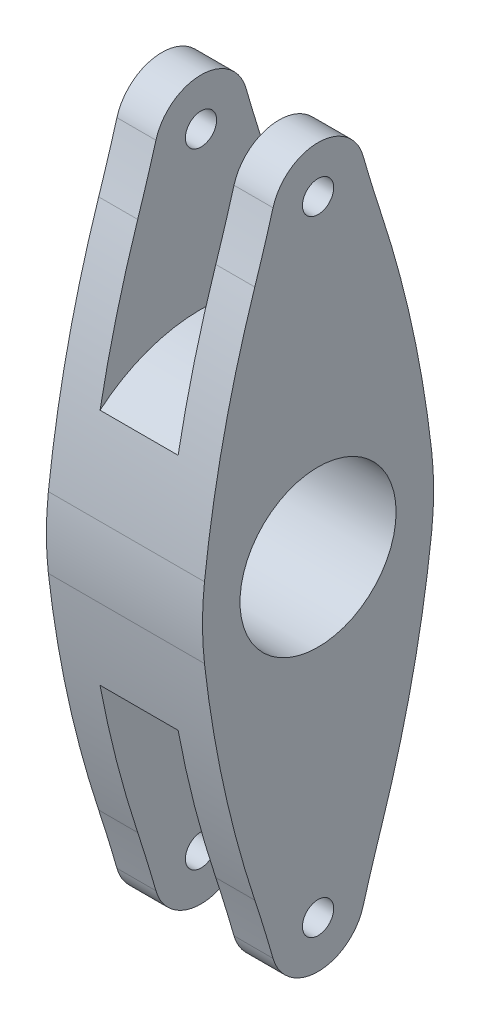
ISO-10303-21;
HEADER;
FILE_DESCRIPTION(('STEP AP214'),'2;1');
FILE_NAME('part.step','',(''),(''),'','','');
FILE_SCHEMA(('AUTOMOTIVE_DESIGN { 1 0 10303 214 1 1 1 1 }'));
ENDSEC;
DATA;
#1=APPLICATION_CONTEXT('core data for automotive mechanical design processes');
#2=APPLICATION_PROTOCOL_DEFINITION('international standard','automotive_design',2000,#1);
#3=PRODUCT_CONTEXT('',#1,'mechanical');
#4=PRODUCT('Part','Part','',(#3));
#5=PRODUCT_RELATED_PRODUCT_CATEGORY('part','',(#4));
#6=PRODUCT_DEFINITION_FORMATION('','',#4);
#7=PRODUCT_DEFINITION_CONTEXT('part definition',#1,'design');
#8=PRODUCT_DEFINITION('design','',#6,#7);
#9=PRODUCT_DEFINITION_SHAPE('','',#8);
#10=(LENGTH_UNIT() NAMED_UNIT(*) SI_UNIT(.MILLI.,.METRE.));
#11=(NAMED_UNIT(*) PLANE_ANGLE_UNIT() SI_UNIT($,.RADIAN.));
#12=(NAMED_UNIT(*) SI_UNIT($,.STERADIAN.) SOLID_ANGLE_UNIT());
#13=UNCERTAINTY_MEASURE_WITH_UNIT(LENGTH_MEASURE(1.E-05),#10,'distance_accuracy_value','');
#14=(GEOMETRIC_REPRESENTATION_CONTEXT(3) GLOBAL_UNCERTAINTY_ASSIGNED_CONTEXT((#13)) GLOBAL_UNIT_ASSIGNED_CONTEXT((#10,
#11,#12)) REPRESENTATION_CONTEXT('',''));
#15=CARTESIAN_POINT('',(0.,0.,0.));
#16=DIRECTION('',(0.,0.,1.));
#17=DIRECTION('',(1.,0.,0.));
#18=AXIS2_PLACEMENT_3D('',#15,#16,#17);
#19=CARTESIAN_POINT('',(5.,-3.08420119348635,-33.3047830821615));
#20=DIRECTION('',(-1.,0.,0.));
#21=DIRECTION('',(0.,0.,1.));
#22=AXIS2_PLACEMENT_3D('',#19,#20,#21);
#23=CYLINDRICAL_SURFACE('',#22,37.1829160538539);
#24=CARTESIAN_POINT('',(3.75,-3.08420119348635,-33.3047830821615));
#25=DIRECTION('',(-1.,0.,0.));
#26=DIRECTION('',(0.,0.,1.));
#27=AXIS2_PLACEMENT_3D('',#24,#25,#26);
#28=CIRCLE('',#27,37.1829160538539);
#29=CARTESIAN_POINT('',(3.75,3.8145264666766,3.23255128884657));
#30=VERTEX_POINT('',#29);
#31=CARTESIAN_POINT('',(3.75,8.50449351808189,2.02610144044867));
#32=VERTEX_POINT('',#31);
#33=EDGE_CURVE('E277',#30,#32,#28,.T.);
#34=ORIENTED_EDGE('',*,*,#33,.F.);
#35=DIRECTION('',(-1.,0.,0.));
#36=VECTOR('',#35,1.);
#37=CARTESIAN_POINT('',(3.75,3.8145264666766,3.23255128884657));
#38=LINE('',#37,#36);
#39=CARTESIAN_POINT('',(1.25,3.8145264666766,3.23255128884657));
#40=VERTEX_POINT('',#39);
#41=EDGE_CURVE('E243',#30,#40,#38,.T.);
#42=ORIENTED_EDGE('',*,*,#41,.T.);
#43=CARTESIAN_POINT('',(1.25,-3.08420119348635,-33.3047830821615));
#44=DIRECTION('',(-1.,0.,0.));
#45=DIRECTION('',(0.,0.,1.));
#46=AXIS2_PLACEMENT_3D('',#43,#44,#45);
#47=CIRCLE('',#46,37.1829160538539);
#48=CARTESIAN_POINT('',(1.25,8.50449351808189,2.02610144044867));
#49=VERTEX_POINT('',#48);
#50=EDGE_CURVE('E259',#40,#49,#47,.T.);
#51=ORIENTED_EDGE('',*,*,#50,.T.);
#52=DIRECTION('',(-1.,0.,0.));
#53=VECTOR('',#52,1.);
#54=CARTESIAN_POINT('',(5.,8.50449351808189,2.02610144044867));
#55=LINE('',#54,#53);
#56=CARTESIAN_POINT('',(0.,8.5044935180819,2.02610144044867));
#57=VERTEX_POINT('',#56);
#58=EDGE_CURVE('E391',#49,#57,#55,.T.);
#59=ORIENTED_EDGE('',*,*,#58,.T.);
#60=CARTESIAN_POINT('',(0.,-3.08420119348635,-33.3047830821615));
#61=DIRECTION('',(1.,0.,0.));
#62=DIRECTION('',(0.,0.,1.));
#63=AXIS2_PLACEMENT_3D('',#60,#61,#62);
#64=CIRCLE('',#63,37.1829160538539);
#65=CARTESIAN_POINT('',(0.,1.13461013063353,3.63802240523242));
#66=VERTEX_POINT('',#65);
#67=EDGE_CURVE('E323',#57,#66,#64,.T.);
#68=ORIENTED_EDGE('',*,*,#67,.T.);
#69=DIRECTION('',(-1.,0.,0.));
#70=VECTOR('',#69,1.);
#71=CARTESIAN_POINT('',(5.,1.13461013063353,3.63802240523242));
#72=LINE('',#71,#70);
#73=CARTESIAN_POINT('',(5.,1.13461013063353,3.63802240523242));
#74=VERTEX_POINT('',#73);
#75=EDGE_CURVE('E447',#66,#74,#72,.F.);
#76=ORIENTED_EDGE('',*,*,#75,.T.);
#77=CARTESIAN_POINT('',(5.,-3.08420119348635,-33.3047830821615));
#78=DIRECTION('',(1.,0.,0.));
#79=DIRECTION('',(0.,0.,1.));
#80=AXIS2_PLACEMENT_3D('',#77,#78,#79);
#81=CIRCLE('',#80,37.1829160538539);
#82=CARTESIAN_POINT('',(5.,8.5044935180819,2.02610144044867));
#83=VERTEX_POINT('',#82);
#84=EDGE_CURVE('E327',#83,#74,#81,.T.);
#85=ORIENTED_EDGE('',*,*,#84,.F.);
#86=EDGE_CURVE('E392',#83,#32,#55,.T.);
#87=ORIENTED_EDGE('',*,*,#86,.T.);
#88=EDGE_LOOP('',(#34,#42,#51,#59,#68,#76,#85,#87));
#89=FACE_BOUND('',#88,.T.);
#90=ADVANCED_FACE('F42',(#89),#23,.T.);
#91=CARTESIAN_POINT('',(5.,3.08420119348635,-33.3047830821615));
#92=DIRECTION('',(-1.,0.,0.));
#93=DIRECTION('',(0.,0.,1.));
#94=AXIS2_PLACEMENT_3D('',#91,#92,#93);
#95=CYLINDRICAL_SURFACE('',#94,37.1829160538539);
#96=CARTESIAN_POINT('',(3.75,3.08420119348635,-33.3047830821615));
#97=DIRECTION('',(-1.,0.,0.));
#98=DIRECTION('',(0.,0.,1.));
#99=AXIS2_PLACEMENT_3D('',#96,#97,#98);
#100=CIRCLE('',#99,37.1829160538539);
#101=CARTESIAN_POINT('',(3.75,-8.50449351808188,2.02610144044867));
#102=VERTEX_POINT('',#101);
#103=CARTESIAN_POINT('',(3.75,-3.8145264666766,3.23255128884656));
#104=VERTEX_POINT('',#103);
#105=EDGE_CURVE('E216',#102,#104,#100,.T.);
#106=ORIENTED_EDGE('',*,*,#105,.F.);
#107=DIRECTION('',(-1.,0.,0.));
#108=VECTOR('',#107,1.);
#109=CARTESIAN_POINT('',(5.,-8.50449351808186,2.02610144044869));
#110=LINE('',#109,#108);
#111=CARTESIAN_POINT('',(5.,-8.50449351808186,2.02610144044869));
#112=VERTEX_POINT('',#111);
#113=EDGE_CURVE('E387',#102,#112,#110,.F.);
#114=ORIENTED_EDGE('',*,*,#113,.T.);
#115=CARTESIAN_POINT('',(5.,3.08420119348635,-33.3047830821615));
#116=DIRECTION('',(1.,0.,0.));
#117=DIRECTION('',(0.,0.,-1.));
#118=AXIS2_PLACEMENT_3D('',#115,#116,#117);
#119=CIRCLE('',#118,37.1829160538539);
#120=CARTESIAN_POINT('',(5.,-1.13461013063353,3.63802240523242));
#121=VERTEX_POINT('',#120);
#122=EDGE_CURVE('E331',#121,#112,#119,.T.);
#123=ORIENTED_EDGE('',*,*,#122,.F.);
#124=DIRECTION('',(-1.,0.,0.));
#125=VECTOR('',#124,1.);
#126=CARTESIAN_POINT('',(5.,-1.13461013063353,3.63802240523242));
#127=LINE('',#126,#125);
#128=CARTESIAN_POINT('',(0.,-1.13461013063353,3.63802240523242));
#129=VERTEX_POINT('',#128);
#130=EDGE_CURVE('E437',#121,#129,#127,.T.);
#131=ORIENTED_EDGE('',*,*,#130,.T.);
#132=CARTESIAN_POINT('',(0.,3.08420119348635,-33.3047830821615));
#133=DIRECTION('',(1.,0.,0.));
#134=DIRECTION('',(0.,0.,-1.));
#135=AXIS2_PLACEMENT_3D('',#132,#133,#134);
#136=CIRCLE('',#135,37.1829160538539);
#137=CARTESIAN_POINT('',(0.,-8.50449351808186,2.02610144044869));
#138=VERTEX_POINT('',#137);
#139=EDGE_CURVE('E356',#129,#138,#136,.T.);
#140=ORIENTED_EDGE('',*,*,#139,.T.);
#141=CARTESIAN_POINT('',(1.25,-8.50449351808186,2.02610144044869));
#142=VERTEX_POINT('',#141);
#143=EDGE_CURVE('E388',#138,#142,#110,.F.);
#144=ORIENTED_EDGE('',*,*,#143,.T.);
#145=CARTESIAN_POINT('',(1.25,3.08420119348635,-33.3047830821615));
#146=DIRECTION('',(-1.,0.,0.));
#147=DIRECTION('',(0.,0.,1.));
#148=AXIS2_PLACEMENT_3D('',#145,#146,#147);
#149=CIRCLE('',#148,37.1829160538539);
#150=CARTESIAN_POINT('',(1.25,-3.8145264666766,3.23255128884656));
#151=VERTEX_POINT('',#150);
#152=EDGE_CURVE('E58',#142,#151,#149,.T.);
#153=ORIENTED_EDGE('',*,*,#152,.T.);
#154=DIRECTION('',(-1.,0.,0.));
#155=VECTOR('',#154,1.);
#156=CARTESIAN_POINT('',(3.75,-3.8145264666766,3.23255128884656));
#157=LINE('',#156,#155);
#158=EDGE_CURVE('E209',#104,#151,#157,.T.);
#159=ORIENTED_EDGE('',*,*,#158,.F.);
#160=EDGE_LOOP('',(#106,#114,#123,#131,#140,#144,#153,#159));
#161=FACE_BOUND('',#160,.T.);
#162=ADVANCED_FACE('F227',(#161),#95,.T.);
#163=CARTESIAN_POINT('',(5.,-10.,0.));
#164=DIRECTION('',(-1.,0.,0.));
#165=DIRECTION('',(0.,0.,1.));
#166=AXIS2_PLACEMENT_3D('',#163,#164,#165);
#167=CYLINDRICAL_SURFACE('',#166,1.5);
#168=CARTESIAN_POINT('',(3.75,-10.,0.));
#169=DIRECTION('',(-1.,0.,0.));
#170=DIRECTION('',(0.,0.,1.));
#171=AXIS2_PLACEMENT_3D('',#168,#169,#170);
#172=CIRCLE('',#171,1.5);
#173=CARTESIAN_POINT('',(3.75,-10.4103258062322,-1.44278644737878));
#174=VERTEX_POINT('',#173);
#175=CARTESIAN_POINT('',(3.75,-10.4103258062322,1.44278644737878));
#176=VERTEX_POINT('',#175);
#177=EDGE_CURVE('E235',#174,#176,#172,.T.);
#178=ORIENTED_EDGE('',*,*,#177,.F.);
#179=DIRECTION('',(-1.,0.,0.));
#180=VECTOR('',#179,1.);
#181=CARTESIAN_POINT('',(5.,-10.4103258062322,-1.44278644737879));
#182=LINE('',#181,#180);
#183=CARTESIAN_POINT('',(5.,-10.4103258062322,-1.44278644737879));
#184=VERTEX_POINT('',#183);
#185=EDGE_CURVE('E382',#174,#184,#182,.F.);
#186=ORIENTED_EDGE('',*,*,#185,.T.);
#187=CARTESIAN_POINT('',(5.,-10.,0.));
#188=DIRECTION('',(1.,0.,0.));
#189=DIRECTION('',(0.,0.,-1.));
#190=AXIS2_PLACEMENT_3D('',#187,#188,#189);
#191=CIRCLE('',#190,1.5);
#192=CARTESIAN_POINT('',(5.,-10.4103258062322,1.44278644737878));
#193=VERTEX_POINT('',#192);
#194=EDGE_CURVE('E336',#193,#184,#191,.T.);
#195=ORIENTED_EDGE('',*,*,#194,.F.);
#196=DIRECTION('',(-1.,0.,0.));
#197=VECTOR('',#196,1.);
#198=CARTESIAN_POINT('',(5.,-10.4103258062322,1.44278644737878));
#199=LINE('',#198,#197);
#200=EDGE_CURVE('E378',#193,#176,#199,.T.);
#201=ORIENTED_EDGE('',*,*,#200,.T.);
#202=EDGE_LOOP('',(#178,#186,#195,#201));
#203=FACE_BOUND('',#202,.T.);
#204=ADVANCED_FACE('F558',(#203),#167,.T.);
#205=CARTESIAN_POINT('',(5.,3.08420119348634,33.3047830821615));
#206=DIRECTION('',(-1.,0.,0.));
#207=DIRECTION('',(0.,0.,1.));
#208=AXIS2_PLACEMENT_3D('',#205,#206,#207);
#209=CYLINDRICAL_SURFACE('',#208,37.1829160538539);
#210=CARTESIAN_POINT('',(3.75,3.08420119348634,33.3047830821615));
#211=DIRECTION('',(-1.,0.,0.));
#212=DIRECTION('',(0.,0.,1.));
#213=AXIS2_PLACEMENT_3D('',#210,#211,#212);
#214=CIRCLE('',#213,37.1829160538539);
#215=CARTESIAN_POINT('',(3.75,-3.81452646667659,-3.23255128884657));
#216=VERTEX_POINT('',#215);
#217=CARTESIAN_POINT('',(3.75,-8.50449351808187,-2.02610144044868));
#218=VERTEX_POINT('',#217);
#219=EDGE_CURVE('E215',#216,#218,#214,.T.);
#220=ORIENTED_EDGE('',*,*,#219,.F.);
#221=DIRECTION('',(-1.,0.,0.));
#222=VECTOR('',#221,1.);
#223=CARTESIAN_POINT('',(3.75,-3.81452646667659,-3.23255128884657));
#224=LINE('',#223,#222);
#225=CARTESIAN_POINT('',(1.25,-3.81452646667659,-3.23255128884657));
#226=VERTEX_POINT('',#225);
#227=EDGE_CURVE('E211',#216,#226,#224,.T.);
#228=ORIENTED_EDGE('',*,*,#227,.T.);
#229=CARTESIAN_POINT('',(1.25,3.08420119348634,33.3047830821615));
#230=DIRECTION('',(-1.,0.,0.));
#231=DIRECTION('',(0.,0.,1.));
#232=AXIS2_PLACEMENT_3D('',#229,#230,#231);
#233=CIRCLE('',#232,37.1829160538539);
#234=CARTESIAN_POINT('',(1.25,-8.50449351808187,-2.02610144044868));
#235=VERTEX_POINT('',#234);
#236=EDGE_CURVE('E501',#226,#235,#233,.T.);
#237=ORIENTED_EDGE('',*,*,#236,.T.);
#238=DIRECTION('',(-1.,0.,0.));
#239=VECTOR('',#238,1.);
#240=CARTESIAN_POINT('',(5.,-8.50449351808189,-2.02610144044867));
#241=LINE('',#240,#239);
#242=CARTESIAN_POINT('',(0.,-8.50449351808189,-2.02610144044867));
#243=VERTEX_POINT('',#242);
#244=EDGE_CURVE('E352',#235,#243,#241,.T.);
#245=ORIENTED_EDGE('',*,*,#244,.T.);
#246=CARTESIAN_POINT('',(0.,3.08420119348634,33.3047830821615));
#247=DIRECTION('',(1.,0.,0.));
#248=DIRECTION('',(0.,0.,1.));
#249=AXIS2_PLACEMENT_3D('',#246,#247,#248);
#250=CIRCLE('',#249,37.1829160538539);
#251=CARTESIAN_POINT('',(0.,-1.13461013063353,-3.63802240523242));
#252=VERTEX_POINT('',#251);
#253=EDGE_CURVE('E363',#243,#252,#250,.T.);
#254=ORIENTED_EDGE('',*,*,#253,.T.);
#255=DIRECTION('',(-1.,0.,0.));
#256=VECTOR('',#255,1.);
#257=CARTESIAN_POINT('',(5.,-1.13461013063353,-3.63802240523242));
#258=LINE('',#257,#256);
#259=CARTESIAN_POINT('',(5.,-1.13461013063353,-3.63802240523242));
#260=VERTEX_POINT('',#259);
#261=EDGE_CURVE('E11',#252,#260,#258,.F.);
#262=ORIENTED_EDGE('',*,*,#261,.T.);
#263=CARTESIAN_POINT('',(5.,3.08420119348634,33.3047830821615));
#264=DIRECTION('',(1.,0.,0.));
#265=DIRECTION('',(0.,0.,1.));
#266=AXIS2_PLACEMENT_3D('',#263,#264,#265);
#267=CIRCLE('',#266,37.1829160538539);
#268=CARTESIAN_POINT('',(5.,-8.50449351808189,-2.02610144044867));
#269=VERTEX_POINT('',#268);
#270=EDGE_CURVE('E340',#269,#260,#267,.T.);
#271=ORIENTED_EDGE('',*,*,#270,.F.);
#272=EDGE_CURVE('E373',#269,#218,#241,.T.);
#273=ORIENTED_EDGE('',*,*,#272,.T.);
#274=EDGE_LOOP('',(#220,#228,#237,#245,#254,#262,#271,#273));
#275=FACE_BOUND('',#274,.T.);
#276=ADVANCED_FACE('F499',(#275),#209,.T.);
#277=CARTESIAN_POINT('',(5.,-3.08420119348634,33.3047830821615));
#278=DIRECTION('',(-1.,0.,0.));
#279=DIRECTION('',(0.,0.,1.));
#280=AXIS2_PLACEMENT_3D('',#277,#278,#279);
#281=CYLINDRICAL_SURFACE('',#280,37.1829160538539);
#282=CARTESIAN_POINT('',(3.75,-3.08420119348634,33.3047830821615));
#283=DIRECTION('',(-1.,0.,0.));
#284=DIRECTION('',(0.,0.,1.));
#285=AXIS2_PLACEMENT_3D('',#282,#283,#284);
#286=CIRCLE('',#285,37.1829160538539);
#287=CARTESIAN_POINT('',(3.75,8.50449351808186,-2.02610144044868));
#288=VERTEX_POINT('',#287);
#289=CARTESIAN_POINT('',(3.75,3.81452646667659,-3.23255128884657));
#290=VERTEX_POINT('',#289);
#291=EDGE_CURVE('E251',#288,#290,#286,.T.);
#292=ORIENTED_EDGE('',*,*,#291,.F.);
#293=DIRECTION('',(-1.,0.,0.));
#294=VECTOR('',#293,1.);
#295=CARTESIAN_POINT('',(5.,8.50449351808189,-2.02610144044867));
#296=LINE('',#295,#294);
#297=CARTESIAN_POINT('',(5.,8.50449351808189,-2.02610144044867));
#298=VERTEX_POINT('',#297);
#299=EDGE_CURVE('E406',#288,#298,#296,.F.);
#300=ORIENTED_EDGE('',*,*,#299,.T.);
#301=CARTESIAN_POINT('',(5.,-3.08420119348634,33.3047830821615));
#302=DIRECTION('',(1.,0.,0.));
#303=DIRECTION('',(0.,0.,-1.));
#304=AXIS2_PLACEMENT_3D('',#301,#302,#303);
#305=CIRCLE('',#304,37.1829160538539);
#306=CARTESIAN_POINT('',(5.,1.13461013063353,-3.63802240523242));
#307=VERTEX_POINT('',#306);
#308=EDGE_CURVE('E344',#307,#298,#305,.T.);
#309=ORIENTED_EDGE('',*,*,#308,.F.);
#310=DIRECTION('',(-1.,0.,0.));
#311=VECTOR('',#310,1.);
#312=CARTESIAN_POINT('',(5.,1.13461013063353,-3.63802240523242));
#313=LINE('',#312,#311);
#314=CARTESIAN_POINT('',(0.,1.13461013063353,-3.63802240523242));
#315=VERTEX_POINT('',#314);
#316=EDGE_CURVE('E51',#307,#315,#313,.T.);
#317=ORIENTED_EDGE('',*,*,#316,.T.);
#318=CARTESIAN_POINT('',(0.,-3.08420119348634,33.3047830821615));
#319=DIRECTION('',(1.,0.,0.));
#320=DIRECTION('',(0.,0.,-1.));
#321=AXIS2_PLACEMENT_3D('',#318,#319,#320);
#322=CIRCLE('',#321,37.1829160538539);
#323=CARTESIAN_POINT('',(0.,8.50449351808189,-2.02610144044867));
#324=VERTEX_POINT('',#323);
#325=EDGE_CURVE('E367',#315,#324,#322,.T.);
#326=ORIENTED_EDGE('',*,*,#325,.T.);
#327=CARTESIAN_POINT('',(1.25,8.50449351808189,-2.02610144044867));
#328=VERTEX_POINT('',#327);
#329=EDGE_CURVE('E407',#324,#328,#296,.F.);
#330=ORIENTED_EDGE('',*,*,#329,.T.);
#331=CARTESIAN_POINT('',(1.25,-3.08420119348634,33.3047830821615));
#332=DIRECTION('',(-1.,0.,0.));
#333=DIRECTION('',(0.,0.,1.));
#334=AXIS2_PLACEMENT_3D('',#331,#332,#333);
#335=CIRCLE('',#334,37.1829160538539);
#336=CARTESIAN_POINT('',(1.25,3.81452646667659,-3.23255128884657));
#337=VERTEX_POINT('',#336);
#338=EDGE_CURVE('E66',#328,#337,#335,.T.);
#339=ORIENTED_EDGE('',*,*,#338,.T.);
#340=DIRECTION('',(-1.,0.,0.));
#341=VECTOR('',#340,1.);
#342=CARTESIAN_POINT('',(3.75,3.81452646667659,-3.23255128884657));
#343=LINE('',#342,#341);
#344=EDGE_CURVE('E239',#290,#337,#343,.T.);
#345=ORIENTED_EDGE('',*,*,#344,.F.);
#346=EDGE_LOOP('',(#292,#300,#309,#317,#326,#330,#339,#345));
#347=FACE_BOUND('',#346,.T.);
#348=ADVANCED_FACE('F462',(#347),#281,.T.);
#349=CARTESIAN_POINT('',(5.,10.,0.));
#350=DIRECTION('',(-1.,0.,0.));
#351=DIRECTION('',(0.,0.,1.));
#352=AXIS2_PLACEMENT_3D('',#349,#350,#351);
#353=CYLINDRICAL_SURFACE('',#352,1.5);
#354=CARTESIAN_POINT('',(3.75,10.,0.));
#355=DIRECTION('',(-1.,0.,0.));
#356=DIRECTION('',(0.,0.,1.));
#357=AXIS2_PLACEMENT_3D('',#354,#355,#356);
#358=CIRCLE('',#357,1.5);
#359=CARTESIAN_POINT('',(3.75,10.4103258062322,1.44278644737877));
#360=VERTEX_POINT('',#359);
#361=CARTESIAN_POINT('',(3.75,10.4103258062322,-1.44278644737879));
#362=VERTEX_POINT('',#361);
#363=EDGE_CURVE('E271',#360,#362,#358,.T.);
#364=ORIENTED_EDGE('',*,*,#363,.F.);
#365=DIRECTION('',(-1.,0.,0.));
#366=VECTOR('',#365,1.);
#367=CARTESIAN_POINT('',(5.,10.4103258062322,1.44278644737878));
#368=LINE('',#367,#366);
#369=CARTESIAN_POINT('',(5.,10.4103258062322,1.44278644737878));
#370=VERTEX_POINT('',#369);
#371=EDGE_CURVE('E401',#360,#370,#368,.F.);
#372=ORIENTED_EDGE('',*,*,#371,.T.);
#373=CARTESIAN_POINT('',(5.,10.,0.));
#374=DIRECTION('',(1.,0.,0.));
#375=DIRECTION('',(0.,0.,-1.));
#376=AXIS2_PLACEMENT_3D('',#373,#374,#375);
#377=CIRCLE('',#376,1.5);
#378=CARTESIAN_POINT('',(5.,10.4103258062322,-1.44278644737878));
#379=VERTEX_POINT('',#378);
#380=EDGE_CURVE('E348',#379,#370,#377,.T.);
#381=ORIENTED_EDGE('',*,*,#380,.F.);
#382=DIRECTION('',(-1.,0.,0.));
#383=VECTOR('',#382,1.);
#384=CARTESIAN_POINT('',(5.,10.4103258062322,-1.44278644737878));
#385=LINE('',#384,#383);
#386=EDGE_CURVE('E397',#379,#362,#385,.T.);
#387=ORIENTED_EDGE('',*,*,#386,.T.);
#388=EDGE_LOOP('',(#364,#372,#381,#387));
#389=FACE_BOUND('',#388,.T.);
#390=ADVANCED_FACE('F542',(#389),#353,.T.);
#391=CARTESIAN_POINT('',(5.,10.,0.));
#392=DIRECTION('',(-1.,0.,0.));
#393=DIRECTION('',(0.,0.,1.));
#394=AXIS2_PLACEMENT_3D('',#391,#392,#393);
#395=CYLINDRICAL_SURFACE('',#394,0.5);
#396=CARTESIAN_POINT('',(5.,10.,0.));
#397=DIRECTION('',(1.,0.,0.));
#398=DIRECTION('',(0.,0.,-1.));
#399=AXIS2_PLACEMENT_3D('',#396,#397,#398);
#400=CIRCLE('',#399,0.5);
#401=CARTESIAN_POINT('',(5.,10.,-0.5));
#402=VERTEX_POINT('',#401);
#403=EDGE_CURVE('E311',#402,#402,#400,.T.);
#404=ORIENTED_EDGE('',*,*,#403,.T.);
#405=EDGE_LOOP('',(#404));
#406=FACE_BOUND('',#405,.T.);
#407=CARTESIAN_POINT('',(3.75,10.,0.));
#408=DIRECTION('',(-1.,0.,0.));
#409=DIRECTION('',(0.,0.,1.));
#410=AXIS2_PLACEMENT_3D('',#407,#408,#409);
#411=CIRCLE('',#410,0.5);
#412=CARTESIAN_POINT('',(3.75,10.,0.5));
#413=VERTEX_POINT('',#412);
#414=EDGE_CURVE('E290',#413,#413,#411,.T.);
#415=ORIENTED_EDGE('',*,*,#414,.T.);
#416=EDGE_LOOP('',(#415));
#417=FACE_BOUND('',#416,.T.);
#418=ADVANCED_FACE('F562',(#406,#417),#395,.F.);
#419=CARTESIAN_POINT('',(5.,-10.,0.));
#420=DIRECTION('',(-1.,0.,0.));
#421=DIRECTION('',(0.,0.,1.));
#422=AXIS2_PLACEMENT_3D('',#419,#420,#421);
#423=CYLINDRICAL_SURFACE('',#422,0.5);
#424=CARTESIAN_POINT('',(5.,-10.,0.));
#425=DIRECTION('',(1.,0.,0.));
#426=DIRECTION('',(0.,0.,-1.));
#427=AXIS2_PLACEMENT_3D('',#424,#425,#426);
#428=CIRCLE('',#427,0.5);
#429=CARTESIAN_POINT('',(5.,-10.,-0.500000000000001));
#430=VERTEX_POINT('',#429);
#431=EDGE_CURVE('E303',#430,#430,#428,.T.);
#432=ORIENTED_EDGE('',*,*,#431,.T.);
#433=EDGE_LOOP('',(#432));
#434=FACE_BOUND('',#433,.T.);
#435=CARTESIAN_POINT('',(3.75,-10.,0.));
#436=DIRECTION('',(-1.,0.,0.));
#437=DIRECTION('',(0.,0.,1.));
#438=AXIS2_PLACEMENT_3D('',#435,#436,#437);
#439=CIRCLE('',#438,0.5);
#440=CARTESIAN_POINT('',(3.75,-10.,0.499999999999999));
#441=VERTEX_POINT('',#440);
#442=EDGE_CURVE('E298',#441,#441,#439,.T.);
#443=ORIENTED_EDGE('',*,*,#442,.T.);
#444=EDGE_LOOP('',(#443));
#445=FACE_BOUND('',#444,.T.);
#446=ADVANCED_FACE('F636',(#434,#445),#423,.F.);
#447=CARTESIAN_POINT('',(5.,-24.0878526806389,-49.5356680266716));
#448=DIRECTION('',(1.,0.,0.));
#449=DIRECTION('',(0.,0.,-1.));
#450=AXIS2_PLACEMENT_3D('',#447,#448,#449);
#451=CYLINDRICAL_SURFACE('',#450,50.);
#452=CARTESIAN_POINT('',(3.75,-24.0878526806389,-49.5356680266716));
#453=DIRECTION('',(1.,0.,0.));
#454=DIRECTION('',(0.,0.,1.));
#455=AXIS2_PLACEMENT_3D('',#452,#453,#454);
#456=CIRCLE('',#455,50.);
#457=EDGE_CURVE('E594',#218,#174,#456,.T.);
#458=ORIENTED_EDGE('',*,*,#457,.F.);
#459=ORIENTED_EDGE('',*,*,#272,.F.);
#460=CARTESIAN_POINT('',(5.,-24.0878526806389,-49.5356680266716));
#461=DIRECTION('',(-1.,0.,0.));
#462=DIRECTION('',(0.,0.,1.));
#463=AXIS2_PLACEMENT_3D('',#460,#461,#462);
#464=CIRCLE('',#463,50.);
#465=EDGE_CURVE('E414',#184,#269,#464,.T.);
#466=ORIENTED_EDGE('',*,*,#465,.F.);
#467=ORIENTED_EDGE('',*,*,#185,.F.);
#468=EDGE_LOOP('',(#458,#459,#466,#467));
#469=FACE_BOUND('',#468,.T.);
#470=ADVANCED_FACE('F573',(#469),#451,.F.);
#471=CARTESIAN_POINT('',(5.,-24.0878526806388,49.5356680266716));
#472=DIRECTION('',(1.,0.,0.));
#473=DIRECTION('',(0.,0.,-1.));
#474=AXIS2_PLACEMENT_3D('',#471,#472,#473);
#475=CYLINDRICAL_SURFACE('',#474,50.);
#476=CARTESIAN_POINT('',(3.75,-24.0878526806388,49.5356680266716));
#477=DIRECTION('',(1.,0.,0.));
#478=DIRECTION('',(0.,0.,1.));
#479=AXIS2_PLACEMENT_3D('',#476,#477,#478);
#480=CIRCLE('',#479,50.);
#481=EDGE_CURVE('E221',#176,#102,#480,.T.);
#482=ORIENTED_EDGE('',*,*,#481,.F.);
#483=ORIENTED_EDGE('',*,*,#200,.F.);
#484=CARTESIAN_POINT('',(5.,-24.0878526806388,49.5356680266716));
#485=DIRECTION('',(-1.,0.,0.));
#486=DIRECTION('',(0.,0.,1.));
#487=AXIS2_PLACEMENT_3D('',#484,#485,#486);
#488=CIRCLE('',#487,50.);
#489=EDGE_CURVE('E421',#112,#193,#488,.T.);
#490=ORIENTED_EDGE('',*,*,#489,.F.);
#491=ORIENTED_EDGE('',*,*,#113,.F.);
#492=EDGE_LOOP('',(#482,#483,#490,#491));
#493=FACE_BOUND('',#492,.T.);
#494=ADVANCED_FACE('F576',(#493),#475,.F.);
#495=CARTESIAN_POINT('',(5.,24.0878526806389,49.5356680266716));
#496=DIRECTION('',(1.,0.,0.));
#497=DIRECTION('',(0.,0.,-1.));
#498=AXIS2_PLACEMENT_3D('',#495,#496,#497);
#499=CYLINDRICAL_SURFACE('',#498,50.);
#500=CARTESIAN_POINT('',(3.75,24.0878526806389,49.5356680266716));
#501=DIRECTION('',(1.,0.,0.));
#502=DIRECTION('',(0.,0.,1.));
#503=AXIS2_PLACEMENT_3D('',#500,#501,#502);
#504=CIRCLE('',#503,50.);
#505=EDGE_CURVE('E274',#32,#360,#504,.T.);
#506=ORIENTED_EDGE('',*,*,#505,.F.);
#507=ORIENTED_EDGE('',*,*,#86,.F.);
#508=CARTESIAN_POINT('',(5.,24.0878526806389,49.5356680266716));
#509=DIRECTION('',(-1.,0.,0.));
#510=DIRECTION('',(0.,0.,1.));
#511=AXIS2_PLACEMENT_3D('',#508,#509,#510);
#512=CIRCLE('',#511,50.);
#513=EDGE_CURVE('E427',#370,#83,#512,.T.);
#514=ORIENTED_EDGE('',*,*,#513,.F.);
#515=ORIENTED_EDGE('',*,*,#371,.F.);
#516=EDGE_LOOP('',(#506,#507,#514,#515));
#517=FACE_BOUND('',#516,.T.);
#518=ADVANCED_FACE('F532',(#517),#499,.F.);
#519=CARTESIAN_POINT('',(5.,24.0878526806389,-49.5356680266716));
#520=DIRECTION('',(1.,0.,0.));
#521=DIRECTION('',(0.,0.,-1.));
#522=AXIS2_PLACEMENT_3D('',#519,#520,#521);
#523=CYLINDRICAL_SURFACE('',#522,50.);
#524=CARTESIAN_POINT('',(3.75,24.0878526806389,-49.5356680266716));
#525=DIRECTION('',(1.,0.,0.));
#526=DIRECTION('',(0.,0.,1.));
#527=AXIS2_PLACEMENT_3D('',#524,#525,#526);
#528=CIRCLE('',#527,50.);
#529=EDGE_CURVE('E242',#362,#288,#528,.T.);
#530=ORIENTED_EDGE('',*,*,#529,.F.);
#531=ORIENTED_EDGE('',*,*,#386,.F.);
#532=CARTESIAN_POINT('',(5.,24.0878526806389,-49.5356680266716));
#533=DIRECTION('',(-1.,0.,0.));
#534=DIRECTION('',(0.,0.,1.));
#535=AXIS2_PLACEMENT_3D('',#532,#533,#534);
#536=CIRCLE('',#535,50.);
#537=EDGE_CURVE('E434',#298,#379,#536,.T.);
#538=ORIENTED_EDGE('',*,*,#537,.F.);
#539=ORIENTED_EDGE('',*,*,#299,.F.);
#540=EDGE_LOOP('',(#530,#531,#538,#539));
#541=FACE_BOUND('',#540,.T.);
#542=ADVANCED_FACE('F539',(#541),#523,.F.);
#543=CARTESIAN_POINT('',(5.,3.45789940325683,-16.6523915410808));
#544=DIRECTION('',(-1.,0.,0.));
#545=DIRECTION('',(0.,0.,1.));
#546=AXIS2_PLACEMENT_3D('',#543,#544,#545);
#547=PLANE('',#546);
#548=ORIENTED_EDGE('',*,*,#84,.T.);
#549=CARTESIAN_POINT('',(5.,0.,-6.29740208753405));
#550=DIRECTION('',(-1.,0.,0.));
#551=DIRECTION('',(0.,0.,1.));
#552=AXIS2_PLACEMENT_3D('',#549,#550,#551);
#553=CIRCLE('',#552,10.);
#554=EDGE_CURVE('E453',#74,#121,#553,.F.);
#555=ORIENTED_EDGE('',*,*,#554,.T.);
#556=ORIENTED_EDGE('',*,*,#122,.T.);
#557=ORIENTED_EDGE('',*,*,#489,.T.);
#558=ORIENTED_EDGE('',*,*,#194,.T.);
#559=ORIENTED_EDGE('',*,*,#465,.T.);
#560=ORIENTED_EDGE('',*,*,#270,.T.);
#561=CARTESIAN_POINT('',(5.,0.,6.29740208753405));
#562=DIRECTION('',(-1.,0.,0.));
#563=DIRECTION('',(0.,0.,1.));
#564=AXIS2_PLACEMENT_3D('',#561,#562,#563);
#565=CIRCLE('',#564,10.);
#566=EDGE_CURVE('E450',#260,#307,#565,.F.);
#567=ORIENTED_EDGE('',*,*,#566,.T.);
#568=ORIENTED_EDGE('',*,*,#308,.T.);
#569=ORIENTED_EDGE('',*,*,#537,.T.);
#570=ORIENTED_EDGE('',*,*,#380,.T.);
#571=ORIENTED_EDGE('',*,*,#513,.T.);
#572=EDGE_LOOP('',(#548,#555,#556,#557,#558,#559,#560,#567,#568,#569,#570,#571));
#573=FACE_BOUND('',#572,.T.);
#574=CARTESIAN_POINT('',(5.,0.,0.));
#575=DIRECTION('',(1.,0.,0.));
#576=DIRECTION('',(0.,0.,-1.));
#577=AXIS2_PLACEMENT_3D('',#574,#575,#576);
#578=CIRCLE('',#577,2.5);
#579=CARTESIAN_POINT('',(5.,0.,-2.5));
#580=VERTEX_POINT('',#579);
#581=EDGE_CURVE('E319',#580,#580,#578,.T.);
#582=ORIENTED_EDGE('',*,*,#581,.F.);
#583=EDGE_LOOP('',(#582));
#584=FACE_BOUND('',#583,.T.);
#585=ORIENTED_EDGE('',*,*,#403,.F.);
#586=EDGE_LOOP('',(#585));
#587=FACE_BOUND('',#586,.T.);
#588=ORIENTED_EDGE('',*,*,#431,.F.);
#589=EDGE_LOOP('',(#588));
#590=FACE_BOUND('',#589,.T.);
#591=ADVANCED_FACE('F525',(#573,#584,#587,#590),#547,.F.);
#592=CARTESIAN_POINT('',(0.,3.45789940325683,-16.6523915410808));
#593=DIRECTION('',(-1.,0.,0.));
#594=DIRECTION('',(0.,0.,1.));
#595=AXIS2_PLACEMENT_3D('',#592,#593,#594);
#596=PLANE('',#595);
#597=CARTESIAN_POINT('',(0.,10.,0.));
#598=DIRECTION('',(1.,0.,0.));
#599=DIRECTION('',(0.,0.,-1.));
#600=AXIS2_PLACEMENT_3D('',#597,#598,#599);
#601=CIRCLE('',#600,0.5);
#602=CARTESIAN_POINT('',(0.,10.,-0.5));
#603=VERTEX_POINT('',#602);
#604=EDGE_CURVE('E307',#603,#603,#601,.T.);
#605=ORIENTED_EDGE('',*,*,#604,.T.);
#606=EDGE_LOOP('',(#605));
#607=FACE_BOUND('',#606,.T.);
#608=ORIENTED_EDGE('',*,*,#139,.F.);
#609=CARTESIAN_POINT('',(0.,0.,-6.29740208753405));
#610=DIRECTION('',(-1.,0.,0.));
#611=DIRECTION('',(0.,0.,1.));
#612=AXIS2_PLACEMENT_3D('',#609,#610,#611);
#613=CIRCLE('',#612,10.);
#614=EDGE_CURVE('E444',#129,#66,#613,.T.);
#615=ORIENTED_EDGE('',*,*,#614,.T.);
#616=ORIENTED_EDGE('',*,*,#67,.F.);
#617=CARTESIAN_POINT('',(0.,24.0878526806389,49.5356680266716));
#618=DIRECTION('',(-1.,0.,0.));
#619=DIRECTION('',(0.,0.,1.));
#620=AXIS2_PLACEMENT_3D('',#617,#618,#619);
#621=CIRCLE('',#620,50.);
#622=CARTESIAN_POINT('',(0.,10.4103258062322,1.44278644737878));
#623=VERTEX_POINT('',#622);
#624=EDGE_CURVE('E424',#57,#623,#621,.F.);
#625=ORIENTED_EDGE('',*,*,#624,.T.);
#626=CARTESIAN_POINT('',(0.,10.,0.));
#627=DIRECTION('',(1.,0.,0.));
#628=DIRECTION('',(0.,0.,-1.));
#629=AXIS2_PLACEMENT_3D('',#626,#627,#628);
#630=CIRCLE('',#629,1.5);
#631=CARTESIAN_POINT('',(0.,10.4103258062322,-1.44278644737878));
#632=VERTEX_POINT('',#631);
#633=EDGE_CURVE('E332',#632,#623,#630,.T.);
#634=ORIENTED_EDGE('',*,*,#633,.F.);
#635=CARTESIAN_POINT('',(0.,24.0878526806389,-49.5356680266716));
#636=DIRECTION('',(-1.,0.,0.));
#637=DIRECTION('',(0.,0.,1.));
#638=AXIS2_PLACEMENT_3D('',#635,#636,#637);
#639=CIRCLE('',#638,50.);
#640=EDGE_CURVE('E430',#632,#324,#639,.F.);
#641=ORIENTED_EDGE('',*,*,#640,.T.);
#642=ORIENTED_EDGE('',*,*,#325,.F.);
#643=CARTESIAN_POINT('',(0.,0.,6.29740208753405));
#644=DIRECTION('',(-1.,0.,0.));
#645=DIRECTION('',(0.,0.,1.));
#646=AXIS2_PLACEMENT_3D('',#643,#644,#645);
#647=CIRCLE('',#646,10.);
#648=EDGE_CURVE('E441',#315,#252,#647,.T.);
#649=ORIENTED_EDGE('',*,*,#648,.T.);
#650=ORIENTED_EDGE('',*,*,#253,.F.);
#651=CARTESIAN_POINT('',(0.,-24.0878526806389,-49.5356680266716));
#652=DIRECTION('',(-1.,0.,0.));
#653=DIRECTION('',(0.,0.,1.));
#654=AXIS2_PLACEMENT_3D('',#651,#652,#653);
#655=CIRCLE('',#654,50.);
#656=CARTESIAN_POINT('',(0.,-10.4103258062322,-1.44278644737879));
#657=VERTEX_POINT('',#656);
#658=EDGE_CURVE('E411',#243,#657,#655,.F.);
#659=ORIENTED_EDGE('',*,*,#658,.T.);
#660=CARTESIAN_POINT('',(0.,-10.,0.));
#661=DIRECTION('',(1.,0.,0.));
#662=DIRECTION('',(0.,0.,-1.));
#663=AXIS2_PLACEMENT_3D('',#660,#661,#662);
#664=CIRCLE('',#663,1.5);
#665=CARTESIAN_POINT('',(0.,-10.4103258062322,1.44278644737878));
#666=VERTEX_POINT('',#665);
#667=EDGE_CURVE('E359',#666,#657,#664,.T.);
#668=ORIENTED_EDGE('',*,*,#667,.F.);
#669=CARTESIAN_POINT('',(0.,-24.0878526806388,49.5356680266716));
#670=DIRECTION('',(-1.,0.,0.));
#671=DIRECTION('',(0.,0.,1.));
#672=AXIS2_PLACEMENT_3D('',#669,#670,#671);
#673=CIRCLE('',#672,50.);
#674=EDGE_CURVE('E417',#666,#138,#673,.F.);
#675=ORIENTED_EDGE('',*,*,#674,.T.);
#676=EDGE_LOOP('',(#608,#615,#616,#625,#634,#641,#642,#649,#650,#659,#668,#675));
#677=FACE_BOUND('',#676,.T.);
#678=CARTESIAN_POINT('',(0.,0.,0.));
#679=DIRECTION('',(1.,0.,0.));
#680=DIRECTION('',(0.,0.,-1.));
#681=AXIS2_PLACEMENT_3D('',#678,#679,#680);
#682=CIRCLE('',#681,2.5);
#683=CARTESIAN_POINT('',(0.,0.,-2.5));
#684=VERTEX_POINT('',#683);
#685=EDGE_CURVE('E315',#684,#684,#682,.T.);
#686=ORIENTED_EDGE('',*,*,#685,.T.);
#687=EDGE_LOOP('',(#686));
#688=FACE_BOUND('',#687,.T.);
#689=CARTESIAN_POINT('',(0.,-10.,0.));
#690=DIRECTION('',(1.,0.,0.));
#691=DIRECTION('',(0.,0.,-1.));
#692=AXIS2_PLACEMENT_3D('',#689,#690,#691);
#693=CIRCLE('',#692,0.5);
#694=CARTESIAN_POINT('',(0.,-10.,-0.500000000000001));
#695=VERTEX_POINT('',#694);
#696=EDGE_CURVE('E302',#695,#695,#693,.T.);
#697=ORIENTED_EDGE('',*,*,#696,.T.);
#698=EDGE_LOOP('',(#697));
#699=FACE_BOUND('',#698,.T.);
#700=ADVANCED_FACE('F467',(#607,#677,#688,#699),#596,.T.);
#701=CARTESIAN_POINT('',(1.25,-10.4103258062322,-1.44278644737878));
#702=VERTEX_POINT('',#701);
#703=EDGE_CURVE('E383',#657,#702,#182,.F.);
#704=ORIENTED_EDGE('',*,*,#703,.T.);
#705=CARTESIAN_POINT('',(1.25,-10.,0.));
#706=DIRECTION('',(-1.,0.,0.));
#707=DIRECTION('',(0.,0.,1.));
#708=AXIS2_PLACEMENT_3D('',#705,#706,#707);
#709=CIRCLE('',#708,1.5);
#710=CARTESIAN_POINT('',(1.25,-10.4103258062322,1.44278644737878));
#711=VERTEX_POINT('',#710);
#712=EDGE_CURVE('E512',#702,#711,#709,.T.);
#713=ORIENTED_EDGE('',*,*,#712,.T.);
#714=EDGE_CURVE('E377',#711,#666,#199,.T.);
#715=ORIENTED_EDGE('',*,*,#714,.T.);
#716=ORIENTED_EDGE('',*,*,#667,.T.);
#717=EDGE_LOOP('',(#704,#713,#715,#716));
#718=FACE_BOUND('',#717,.T.);
#719=ADVANCED_FACE('F508',(#718),#167,.T.);
#720=CARTESIAN_POINT('',(1.25,10.4103258062322,1.44278644737877));
#721=VERTEX_POINT('',#720);
#722=EDGE_CURVE('E402',#623,#721,#368,.F.);
#723=ORIENTED_EDGE('',*,*,#722,.T.);
#724=CARTESIAN_POINT('',(1.25,10.,0.));
#725=DIRECTION('',(-1.,0.,0.));
#726=DIRECTION('',(0.,0.,1.));
#727=AXIS2_PLACEMENT_3D('',#724,#725,#726);
#728=CIRCLE('',#727,1.5);
#729=CARTESIAN_POINT('',(1.25,10.4103258062322,-1.44278644737879));
#730=VERTEX_POINT('',#729);
#731=EDGE_CURVE('E250',#721,#730,#728,.T.);
#732=ORIENTED_EDGE('',*,*,#731,.T.);
#733=EDGE_CURVE('E396',#730,#632,#385,.T.);
#734=ORIENTED_EDGE('',*,*,#733,.T.);
#735=ORIENTED_EDGE('',*,*,#633,.T.);
#736=EDGE_LOOP('',(#723,#732,#734,#735));
#737=FACE_BOUND('',#736,.T.);
#738=ADVANCED_FACE('F546',(#737),#353,.T.);
#739=CARTESIAN_POINT('',(5.,0.,0.));
#740=DIRECTION('',(-1.,0.,0.));
#741=DIRECTION('',(0.,0.,1.));
#742=AXIS2_PLACEMENT_3D('',#739,#740,#741);
#743=CYLINDRICAL_SURFACE('',#742,2.5);
#744=ORIENTED_EDGE('',*,*,#581,.T.);
#745=EDGE_LOOP('',(#744));
#746=FACE_BOUND('',#745,.T.);
#747=ORIENTED_EDGE('',*,*,#685,.F.);
#748=EDGE_LOOP('',(#747));
#749=FACE_BOUND('',#748,.T.);
#750=ADVANCED_FACE('F548',(#746,#749),#743,.F.);
#751=CARTESIAN_POINT('',(1.25,10.,0.));
#752=DIRECTION('',(-1.,0.,0.));
#753=DIRECTION('',(0.,0.,1.));
#754=AXIS2_PLACEMENT_3D('',#751,#752,#753);
#755=CIRCLE('',#754,0.5);
#756=CARTESIAN_POINT('',(1.25,10.,0.5));
#757=VERTEX_POINT('',#756);
#758=EDGE_CURVE('E233',#757,#757,#755,.T.);
#759=ORIENTED_EDGE('',*,*,#758,.F.);
#760=EDGE_LOOP('',(#759));
#761=FACE_BOUND('',#760,.T.);
#762=ORIENTED_EDGE('',*,*,#604,.F.);
#763=EDGE_LOOP('',(#762));
#764=FACE_BOUND('',#763,.T.);
#765=ADVANCED_FACE('F554',(#761,#764),#395,.F.);
#766=CARTESIAN_POINT('',(1.25,-10.,0.));
#767=DIRECTION('',(-1.,0.,0.));
#768=DIRECTION('',(0.,0.,1.));
#769=AXIS2_PLACEMENT_3D('',#766,#767,#768);
#770=CIRCLE('',#769,0.5);
#771=CARTESIAN_POINT('',(1.25,-10.,0.499999999999999));
#772=VERTEX_POINT('',#771);
#773=EDGE_CURVE('E294',#772,#772,#770,.T.);
#774=ORIENTED_EDGE('',*,*,#773,.F.);
#775=EDGE_LOOP('',(#774));
#776=FACE_BOUND('',#775,.T.);
#777=ORIENTED_EDGE('',*,*,#696,.F.);
#778=EDGE_LOOP('',(#777));
#779=FACE_BOUND('',#778,.T.);
#780=ADVANCED_FACE('F572',(#776,#779),#423,.F.);
#781=ORIENTED_EDGE('',*,*,#244,.F.);
#782=CARTESIAN_POINT('',(1.25,-24.0878526806389,-49.5356680266716));
#783=DIRECTION('',(1.,0.,0.));
#784=DIRECTION('',(0.,0.,1.));
#785=AXIS2_PLACEMENT_3D('',#782,#783,#784);
#786=CIRCLE('',#785,50.);
#787=EDGE_CURVE('E610',#235,#702,#786,.T.);
#788=ORIENTED_EDGE('',*,*,#787,.T.);
#789=ORIENTED_EDGE('',*,*,#703,.F.);
#790=ORIENTED_EDGE('',*,*,#658,.F.);
#791=EDGE_LOOP('',(#781,#788,#789,#790));
#792=FACE_BOUND('',#791,.T.);
#793=ADVANCED_FACE('F505',(#792),#451,.F.);
#794=ORIENTED_EDGE('',*,*,#714,.F.);
#795=CARTESIAN_POINT('',(1.25,-24.0878526806388,49.5356680266716));
#796=DIRECTION('',(1.,0.,0.));
#797=DIRECTION('',(0.,0.,1.));
#798=AXIS2_PLACEMENT_3D('',#795,#796,#797);
#799=CIRCLE('',#798,50.);
#800=EDGE_CURVE('E225',#711,#142,#799,.T.);
#801=ORIENTED_EDGE('',*,*,#800,.T.);
#802=ORIENTED_EDGE('',*,*,#143,.F.);
#803=ORIENTED_EDGE('',*,*,#674,.F.);
#804=EDGE_LOOP('',(#794,#801,#802,#803));
#805=FACE_BOUND('',#804,.T.);
#806=ADVANCED_FACE('F515',(#805),#475,.F.);
#807=ORIENTED_EDGE('',*,*,#58,.F.);
#808=CARTESIAN_POINT('',(1.25,24.0878526806389,49.5356680266716));
#809=DIRECTION('',(1.,0.,0.));
#810=DIRECTION('',(0.,0.,1.));
#811=AXIS2_PLACEMENT_3D('',#808,#809,#810);
#812=CIRCLE('',#811,50.);
#813=EDGE_CURVE('E255',#49,#721,#812,.T.);
#814=ORIENTED_EDGE('',*,*,#813,.T.);
#815=ORIENTED_EDGE('',*,*,#722,.F.);
#816=ORIENTED_EDGE('',*,*,#624,.F.);
#817=EDGE_LOOP('',(#807,#814,#815,#816));
#818=FACE_BOUND('',#817,.T.);
#819=ADVANCED_FACE('F486',(#818),#499,.F.);
#820=ORIENTED_EDGE('',*,*,#733,.F.);
#821=CARTESIAN_POINT('',(1.25,24.0878526806389,-49.5356680266716));
#822=DIRECTION('',(1.,0.,0.));
#823=DIRECTION('',(0.,0.,1.));
#824=AXIS2_PLACEMENT_3D('',#821,#822,#823);
#825=CIRCLE('',#824,50.);
#826=EDGE_CURVE('E247',#730,#328,#825,.T.);
#827=ORIENTED_EDGE('',*,*,#826,.T.);
#828=ORIENTED_EDGE('',*,*,#329,.F.);
#829=ORIENTED_EDGE('',*,*,#640,.F.);
#830=EDGE_LOOP('',(#820,#827,#828,#829));
#831=FACE_BOUND('',#830,.T.);
#832=ADVANCED_FACE('F475',(#831),#523,.F.);
#833=CARTESIAN_POINT('',(5.,0.,-6.29740208753405));
#834=DIRECTION('',(-1.,0.,0.));
#835=DIRECTION('',(0.,0.,1.));
#836=AXIS2_PLACEMENT_3D('',#833,#834,#835);
#837=CYLINDRICAL_SURFACE('',#836,10.);
#838=ORIENTED_EDGE('',*,*,#554,.F.);
#839=ORIENTED_EDGE('',*,*,#75,.F.);
#840=ORIENTED_EDGE('',*,*,#614,.F.);
#841=ORIENTED_EDGE('',*,*,#130,.F.);
#842=EDGE_LOOP('',(#838,#839,#840,#841));
#843=FACE_BOUND('',#842,.T.);
#844=ADVANCED_FACE('F520',(#843),#837,.T.);
#845=CARTESIAN_POINT('',(5.,0.,6.29740208753405));
#846=DIRECTION('',(-1.,0.,0.));
#847=DIRECTION('',(0.,0.,1.));
#848=AXIS2_PLACEMENT_3D('',#845,#846,#847);
#849=CYLINDRICAL_SURFACE('',#848,10.);
#850=ORIENTED_EDGE('',*,*,#566,.F.);
#851=ORIENTED_EDGE('',*,*,#261,.F.);
#852=ORIENTED_EDGE('',*,*,#648,.F.);
#853=ORIENTED_EDGE('',*,*,#316,.F.);
#854=EDGE_LOOP('',(#850,#851,#852,#853));
#855=FACE_BOUND('',#854,.T.);
#856=ADVANCED_FACE('F44',(#855),#849,.T.);
#857=CARTESIAN_POINT('',(3.75,0.,0.));
#858=DIRECTION('',(-1.,0.,0.));
#859=DIRECTION('',(0.,0.,1.));
#860=AXIS2_PLACEMENT_3D('',#857,#858,#859);
#861=CYLINDRICAL_SURFACE('',#860,4.99999999999998);
#862=CARTESIAN_POINT('',(1.25,0.,0.));
#863=DIRECTION('',(1.,0.,0.));
#864=DIRECTION('',(0.,0.,1.));
#865=AXIS2_PLACEMENT_3D('',#862,#863,#864);
#866=CIRCLE('',#865,4.99999999999998);
#867=EDGE_CURVE('E263',#337,#40,#866,.T.);
#868=ORIENTED_EDGE('',*,*,#867,.T.);
#869=ORIENTED_EDGE('',*,*,#41,.F.);
#870=CARTESIAN_POINT('',(3.75,0.,0.));
#871=DIRECTION('',(1.,0.,0.));
#872=DIRECTION('',(0.,0.,1.));
#873=AXIS2_PLACEMENT_3D('',#870,#871,#872);
#874=CIRCLE('',#873,4.99999999999998);
#875=EDGE_CURVE('E280',#290,#30,#874,.T.);
#876=ORIENTED_EDGE('',*,*,#875,.F.);
#877=ORIENTED_EDGE('',*,*,#344,.T.);
#878=EDGE_LOOP('',(#868,#869,#876,#877));
#879=FACE_BOUND('',#878,.T.);
#880=ADVANCED_FACE('F479',(#879),#861,.T.);
#881=CARTESIAN_POINT('',(3.75,-1.54210059674317,16.6523915410808));
#882=DIRECTION('',(-1.,0.,0.));
#883=DIRECTION('',(0.,0.,1.));
#884=AXIS2_PLACEMENT_3D('',#881,#882,#883);
#885=PLANE('',#884);
#886=ORIENTED_EDGE('',*,*,#414,.F.);
#887=EDGE_LOOP('',(#886));
#888=FACE_BOUND('',#887,.T.);
#889=ORIENTED_EDGE('',*,*,#291,.T.);
#890=ORIENTED_EDGE('',*,*,#875,.T.);
#891=ORIENTED_EDGE('',*,*,#33,.T.);
#892=ORIENTED_EDGE('',*,*,#505,.T.);
#893=ORIENTED_EDGE('',*,*,#363,.T.);
#894=ORIENTED_EDGE('',*,*,#529,.T.);
#895=EDGE_LOOP('',(#889,#890,#891,#892,#893,#894));
#896=FACE_BOUND('',#895,.T.);
#897=ADVANCED_FACE('F534',(#888,#896),#885,.T.);
#898=CARTESIAN_POINT('',(1.25,-1.54210059674317,16.6523915410808));
#899=DIRECTION('',(-1.,0.,0.));
#900=DIRECTION('',(0.,0.,1.));
#901=AXIS2_PLACEMENT_3D('',#898,#899,#900);
#902=PLANE('',#901);
#903=ORIENTED_EDGE('',*,*,#758,.T.);
#904=EDGE_LOOP('',(#903));
#905=FACE_BOUND('',#904,.T.);
#906=ORIENTED_EDGE('',*,*,#338,.F.);
#907=ORIENTED_EDGE('',*,*,#826,.F.);
#908=ORIENTED_EDGE('',*,*,#731,.F.);
#909=ORIENTED_EDGE('',*,*,#813,.F.);
#910=ORIENTED_EDGE('',*,*,#50,.F.);
#911=ORIENTED_EDGE('',*,*,#867,.F.);
#912=EDGE_LOOP('',(#906,#907,#908,#909,#910,#911));
#913=FACE_BOUND('',#912,.T.);
#914=ADVANCED_FACE('F480',(#905,#913),#902,.F.);
#915=CARTESIAN_POINT('',(3.75,0.,0.));
#916=DIRECTION('',(-1.,0.,0.));
#917=DIRECTION('',(0.,0.,1.));
#918=AXIS2_PLACEMENT_3D('',#915,#916,#917);
#919=CYLINDRICAL_SURFACE('',#918,4.99999999999998);
#920=CARTESIAN_POINT('',(1.25,0.,0.));
#921=DIRECTION('',(1.,0.,0.));
#922=DIRECTION('',(0.,0.,1.));
#923=AXIS2_PLACEMENT_3D('',#920,#921,#922);
#924=CIRCLE('',#923,4.99999999999998);
#925=EDGE_CURVE('E605',#151,#226,#924,.T.);
#926=ORIENTED_EDGE('',*,*,#925,.T.);
#927=ORIENTED_EDGE('',*,*,#227,.F.);
#928=CARTESIAN_POINT('',(3.75,0.,0.));
#929=DIRECTION('',(1.,0.,0.));
#930=DIRECTION('',(0.,0.,1.));
#931=AXIS2_PLACEMENT_3D('',#928,#929,#930);
#932=CIRCLE('',#931,4.99999999999998);
#933=EDGE_CURVE('E204',#104,#216,#932,.T.);
#934=ORIENTED_EDGE('',*,*,#933,.F.);
#935=ORIENTED_EDGE('',*,*,#158,.T.);
#936=EDGE_LOOP('',(#926,#927,#934,#935));
#937=FACE_BOUND('',#936,.T.);
#938=ADVANCED_FACE('F207',(#937),#919,.T.);
#939=CARTESIAN_POINT('',(3.75,1.54210059674317,-16.6523915410808));
#940=DIRECTION('',(-1.,0.,0.));
#941=DIRECTION('',(0.,0.,1.));
#942=AXIS2_PLACEMENT_3D('',#939,#940,#941);
#943=PLANE('',#942);
#944=ORIENTED_EDGE('',*,*,#442,.F.);
#945=EDGE_LOOP('',(#944));
#946=FACE_BOUND('',#945,.T.);
#947=ORIENTED_EDGE('',*,*,#105,.T.);
#948=ORIENTED_EDGE('',*,*,#933,.T.);
#949=ORIENTED_EDGE('',*,*,#219,.T.);
#950=ORIENTED_EDGE('',*,*,#457,.T.);
#951=ORIENTED_EDGE('',*,*,#177,.T.);
#952=ORIENTED_EDGE('',*,*,#481,.T.);
#953=EDGE_LOOP('',(#947,#948,#949,#950,#951,#952));
#954=FACE_BOUND('',#953,.T.);
#955=ADVANCED_FACE('F219',(#946,#954),#943,.T.);
#956=CARTESIAN_POINT('',(1.25,1.54210059674317,-16.6523915410808));
#957=DIRECTION('',(-1.,0.,0.));
#958=DIRECTION('',(0.,0.,1.));
#959=AXIS2_PLACEMENT_3D('',#956,#957,#958);
#960=PLANE('',#959);
#961=ORIENTED_EDGE('',*,*,#773,.T.);
#962=EDGE_LOOP('',(#961));
#963=FACE_BOUND('',#962,.T.);
#964=ORIENTED_EDGE('',*,*,#152,.F.);
#965=ORIENTED_EDGE('',*,*,#800,.F.);
#966=ORIENTED_EDGE('',*,*,#712,.F.);
#967=ORIENTED_EDGE('',*,*,#787,.F.);
#968=ORIENTED_EDGE('',*,*,#236,.F.);
#969=ORIENTED_EDGE('',*,*,#925,.F.);
#970=EDGE_LOOP('',(#964,#965,#966,#967,#968,#969));
#971=FACE_BOUND('',#970,.T.);
#972=ADVANCED_FACE('F615',(#963,#971),#960,.F.);
#973=CLOSED_SHELL('',(#90,#162,#204,#276,#348,#390,#418,#446,#470,#494,#518,#542,#591,#700,#719,
#738,#750,#765,#780,#793,#806,#819,#832,#844,#856,#880,#897,#914,#938,#955,#972));
#974=MANIFOLD_SOLID_BREP('B2',#973);
#975=ADVANCED_BREP_SHAPE_REPRESENTATION('',(#18,#974),#14);
#976=SHAPE_DEFINITION_REPRESENTATION(#9,#975);
ENDSEC;
END-ISO-10303-21;
